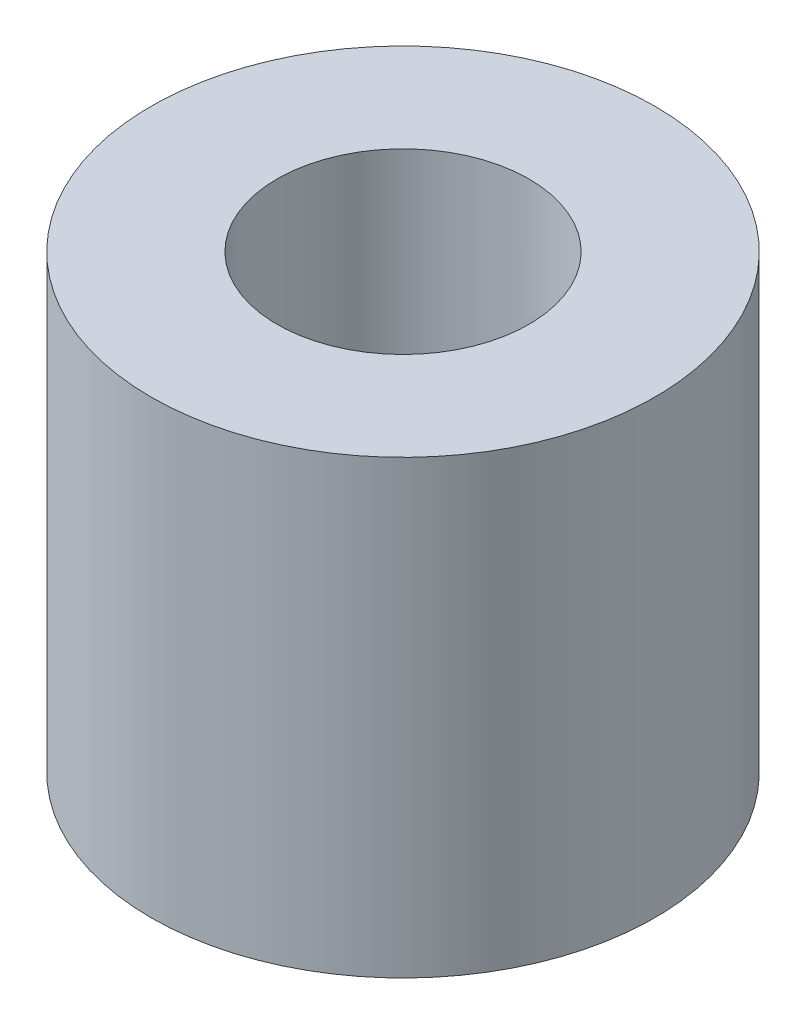
ISO-10303-21;
HEADER;
FILE_DESCRIPTION(('STEP AP214'),'2;1');
FILE_NAME('part.step','',(''),(''),'','','');
FILE_SCHEMA(('AUTOMOTIVE_DESIGN { 1 0 10303 214 1 1 1 1 }'));
ENDSEC;
DATA;
#1=APPLICATION_CONTEXT('core data for automotive mechanical design processes');
#2=APPLICATION_PROTOCOL_DEFINITION('international standard','automotive_design',2000,#1);
#3=PRODUCT_CONTEXT('',#1,'mechanical');
#4=PRODUCT('Part','Part','',(#3));
#5=PRODUCT_RELATED_PRODUCT_CATEGORY('part','',(#4));
#6=PRODUCT_DEFINITION_FORMATION('','',#4);
#7=PRODUCT_DEFINITION_CONTEXT('part definition',#1,'design');
#8=PRODUCT_DEFINITION('design','',#6,#7);
#9=PRODUCT_DEFINITION_SHAPE('','',#8);
#10=(LENGTH_UNIT() NAMED_UNIT(*) SI_UNIT(.MILLI.,.METRE.));
#11=(NAMED_UNIT(*) PLANE_ANGLE_UNIT() SI_UNIT($,.RADIAN.));
#12=(NAMED_UNIT(*) SI_UNIT($,.STERADIAN.) SOLID_ANGLE_UNIT());
#13=UNCERTAINTY_MEASURE_WITH_UNIT(LENGTH_MEASURE(1.E-05),#10,'distance_accuracy_value','');
#14=(GEOMETRIC_REPRESENTATION_CONTEXT(3) GLOBAL_UNCERTAINTY_ASSIGNED_CONTEXT((#13)) GLOBAL_UNIT_ASSIGNED_CONTEXT((#10,
#11,#12)) REPRESENTATION_CONTEXT('',''));
#15=CARTESIAN_POINT('',(0.,0.,0.));
#16=DIRECTION('',(0.,0.,1.));
#17=DIRECTION('',(1.,0.,0.));
#18=AXIS2_PLACEMENT_3D('',#15,#16,#17);
#19=CARTESIAN_POINT('',(0.,136.050556272117,0.));
#20=DIRECTION('',(0.,-1.,0.));
#21=DIRECTION('',(0.,0.,-1.));
#22=AXIS2_PLACEMENT_3D('',#19,#20,#21);
#23=CYLINDRICAL_SURFACE('',#22,7.);
#24=CARTESIAN_POINT('',(0.,103.721566384946,0.));
#25=DIRECTION('',(0.,1.,0.));
#26=DIRECTION('',(0.,0.,1.));
#27=AXIS2_PLACEMENT_3D('',#24,#25,#26);
#28=CIRCLE('',#27,7.);
#29=CARTESIAN_POINT('',(0.,103.721566384946,7.));
#30=VERTEX_POINT('',#29);
#31=EDGE_CURVE('E32',#30,#30,#28,.T.);
#32=ORIENTED_EDGE('',*,*,#31,.T.);
#33=EDGE_LOOP('',(#32));
#34=FACE_BOUND('',#33,.T.);
#35=CARTESIAN_POINT('',(0.,116.251566398893,0.));
#36=DIRECTION('',(0.,1.,0.));
#37=DIRECTION('',(0.,0.,1.));
#38=AXIS2_PLACEMENT_3D('',#35,#36,#37);
#39=CIRCLE('',#38,7.);
#40=CARTESIAN_POINT('',(0.,116.251566398893,7.));
#41=VERTEX_POINT('',#40);
#42=EDGE_CURVE('E10',#41,#41,#39,.T.);
#43=ORIENTED_EDGE('',*,*,#42,.F.);
#44=EDGE_LOOP('',(#43));
#45=FACE_BOUND('',#44,.T.);
#46=ADVANCED_FACE('F29',(#34,#45),#23,.T.);
#47=CARTESIAN_POINT('',(0.,103.721566384946,0.));
#48=DIRECTION('',(0.,1.,0.));
#49=DIRECTION('',(0.,0.,1.));
#50=AXIS2_PLACEMENT_3D('',#47,#48,#49);
#51=PLANE('',#50);
#52=ORIENTED_EDGE('',*,*,#31,.F.);
#53=EDGE_LOOP('',(#52));
#54=FACE_BOUND('',#53,.T.);
#55=CARTESIAN_POINT('',(0.,103.721566384946,0.));
#56=DIRECTION('',(0.,1.,0.));
#57=DIRECTION('',(0.,0.,1.));
#58=AXIS2_PLACEMENT_3D('',#55,#56,#57);
#59=CIRCLE('',#58,3.5);
#60=CARTESIAN_POINT('',(0.,103.721566384946,3.5));
#61=VERTEX_POINT('',#60);
#62=EDGE_CURVE('E42',#61,#61,#59,.T.);
#63=ORIENTED_EDGE('',*,*,#62,.T.);
#64=EDGE_LOOP('',(#63));
#65=FACE_BOUND('',#64,.T.);
#66=ADVANCED_FACE('F51',(#54,#65),#51,.F.);
#67=CARTESIAN_POINT('',(0.,136.050556272117,0.));
#68=DIRECTION('',(0.,-1.,0.));
#69=DIRECTION('',(0.,0.,-1.));
#70=AXIS2_PLACEMENT_3D('',#67,#68,#69);
#71=CYLINDRICAL_SURFACE('',#70,3.5);
#72=ORIENTED_EDGE('',*,*,#62,.F.);
#73=EDGE_LOOP('',(#72));
#74=FACE_BOUND('',#73,.T.);
#75=CARTESIAN_POINT('',(8.55426840473683E-11,116.251566398893,-9.65894031423886E-11));
#76=DIRECTION('',(0.,1.,0.));
#77=DIRECTION('',(-0.947153356248771,0.,-0.320781108774642));
#78=AXIS2_PLACEMENT_3D('',#75,#76,#77);
#79=CIRCLE('',#78,3.5);
#80=CARTESIAN_POINT('',(-3.31503674678516,116.251566398893,-1.12273388080784));
#81=VERTEX_POINT('',#80);
#82=EDGE_CURVE('E36',#81,#81,#79,.T.);
#83=ORIENTED_EDGE('',*,*,#82,.T.);
#84=EDGE_LOOP('',(#83));
#85=FACE_BOUND('',#84,.T.);
#86=ADVANCED_FACE('F53',(#74,#85),#71,.F.);
#87=CARTESIAN_POINT('',(46.5968892456504,116.251566398893,15.7813955880911));
#88=DIRECTION('',(0.,1.,0.));
#89=DIRECTION('',(-0.947153356248771,0.,-0.320781108774642));
#90=AXIS2_PLACEMENT_3D('',#87,#88,#89);
#91=PLANE('',#90);
#92=ORIENTED_EDGE('',*,*,#82,.F.);
#93=EDGE_LOOP('',(#92));
#94=FACE_BOUND('',#93,.T.);
#95=ORIENTED_EDGE('',*,*,#42,.T.);
#96=EDGE_LOOP('',(#95));
#97=FACE_BOUND('',#96,.T.);
#98=ADVANCED_FACE('F58',(#94,#97),#91,.T.);
#99=CLOSED_SHELL('',(#46,#66,#86,#98));
#100=MANIFOLD_SOLID_BREP('B2',#99);
#101=ADVANCED_BREP_SHAPE_REPRESENTATION('',(#18,#100),#14);
#102=SHAPE_DEFINITION_REPRESENTATION(#9,#101);
ENDSEC;
END-ISO-10303-21;
